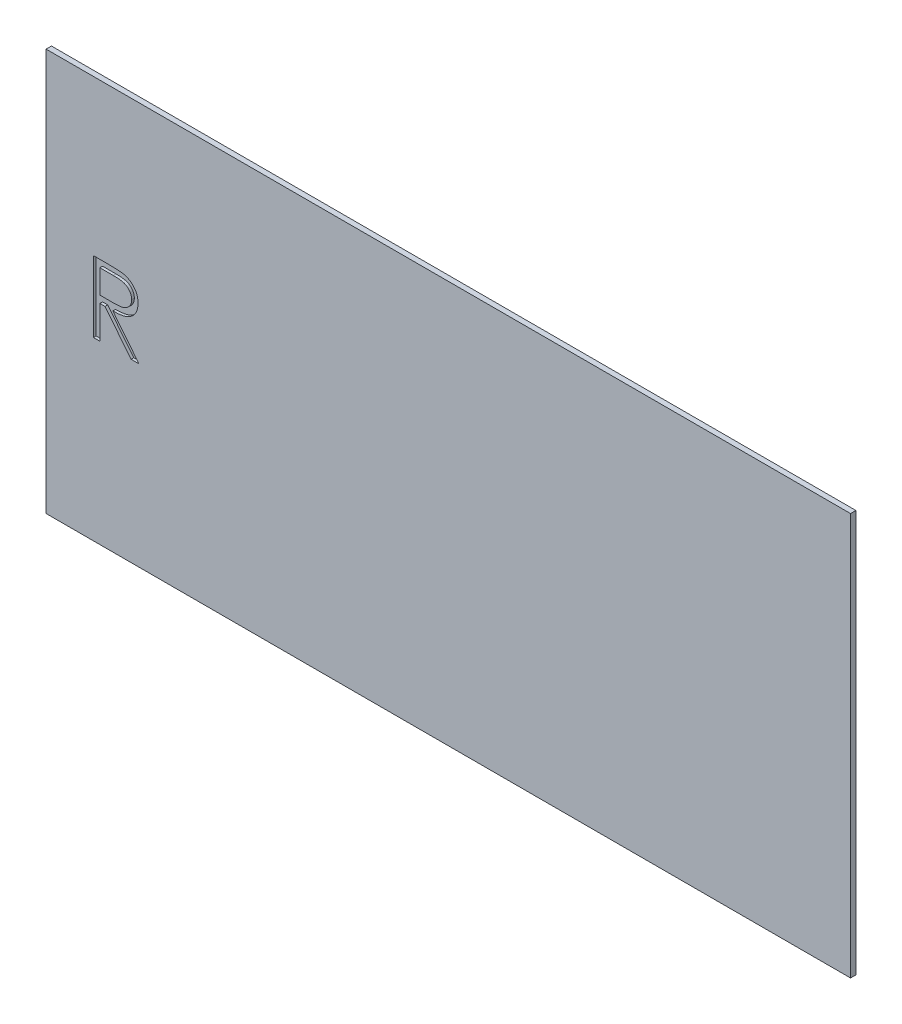
ISO-10303-21;
HEADER;
FILE_DESCRIPTION(('STEP AP214'),'2;1');
FILE_NAME('part.step','',(''),(''),'','','');
FILE_SCHEMA(('AUTOMOTIVE_DESIGN { 1 0 10303 214 1 1 1 1 }'));
ENDSEC;
DATA;
#1=APPLICATION_CONTEXT('core data for automotive mechanical design processes');
#2=APPLICATION_PROTOCOL_DEFINITION('international standard','automotive_design',2000,#1);
#3=PRODUCT_CONTEXT('',#1,'mechanical');
#4=PRODUCT('Part','Part','',(#3));
#5=PRODUCT_RELATED_PRODUCT_CATEGORY('part','',(#4));
#6=PRODUCT_DEFINITION_FORMATION('','',#4);
#7=PRODUCT_DEFINITION_CONTEXT('part definition',#1,'design');
#8=PRODUCT_DEFINITION('design','',#6,#7);
#9=PRODUCT_DEFINITION_SHAPE('','',#8);
#10=(LENGTH_UNIT() NAMED_UNIT(*) SI_UNIT(.MILLI.,.METRE.));
#11=(NAMED_UNIT(*) PLANE_ANGLE_UNIT() SI_UNIT($,.RADIAN.));
#12=(NAMED_UNIT(*) SI_UNIT($,.STERADIAN.) SOLID_ANGLE_UNIT());
#13=UNCERTAINTY_MEASURE_WITH_UNIT(LENGTH_MEASURE(1.E-05),#10,'distance_accuracy_value','');
#14=(GEOMETRIC_REPRESENTATION_CONTEXT(3) GLOBAL_UNCERTAINTY_ASSIGNED_CONTEXT((#13)) GLOBAL_UNIT_ASSIGNED_CONTEXT((#10,
#11,#12)) REPRESENTATION_CONTEXT('',''));
#15=CARTESIAN_POINT('',(0.,0.,0.));
#16=DIRECTION('',(0.,0.,1.));
#17=DIRECTION('',(1.,0.,0.));
#18=AXIS2_PLACEMENT_3D('',#15,#16,#17);
#19=CARTESIAN_POINT('',(0.,0.,10.));
#20=DIRECTION('',(0.,0.,-1.));
#21=DIRECTION('',(-1.,0.,0.));
#22=AXIS2_PLACEMENT_3D('',#19,#20,#21);
#23=PLANE('',#22);
#24=DIRECTION('',(0.,-1.,0.));
#25=VECTOR('',#24,1.);
#26=CARTESIAN_POINT('',(0.,0.,10.));
#27=LINE('',#26,#25);
#28=CARTESIAN_POINT('',(0.,750.,10.));
#29=VERTEX_POINT('',#28);
#30=CARTESIAN_POINT('',(0.,0.,10.));
#31=VERTEX_POINT('',#30);
#32=EDGE_CURVE('E364',#29,#31,#27,.T.);
#33=ORIENTED_EDGE('',*,*,#32,.T.);
#34=DIRECTION('',(1.,0.,0.));
#35=VECTOR('',#34,1.);
#36=CARTESIAN_POINT('',(0.,0.,10.));
#37=LINE('',#36,#35);
#38=CARTESIAN_POINT('',(1500.,0.,10.));
#39=VERTEX_POINT('',#38);
#40=EDGE_CURVE('E367',#31,#39,#37,.T.);
#41=ORIENTED_EDGE('',*,*,#40,.T.);
#42=DIRECTION('',(0.,1.,0.));
#43=VECTOR('',#42,1.);
#44=CARTESIAN_POINT('',(1500.,0.,10.));
#45=LINE('',#44,#43);
#46=CARTESIAN_POINT('',(1500.,750.,10.));
#47=VERTEX_POINT('',#46);
#48=EDGE_CURVE('E370',#39,#47,#45,.T.);
#49=ORIENTED_EDGE('',*,*,#48,.T.);
#50=DIRECTION('',(-1.,0.,0.));
#51=VECTOR('',#50,1.);
#52=CARTESIAN_POINT('',(0.,750.,10.));
#53=LINE('',#52,#51);
#54=EDGE_CURVE('E372',#47,#29,#53,.T.);
#55=ORIENTED_EDGE('',*,*,#54,.T.);
#56=EDGE_LOOP('',(#33,#41,#49,#55));
#57=FACE_BOUND('',#56,.T.);
#58=DIRECTION('',(0.,1.,0.));
#59=VECTOR('',#58,1.);
#60=CARTESIAN_POINT('',(88.344425578022,328.355810368318,10.));
#61=LINE('',#60,#59);
#62=CARTESIAN_POINT('',(88.344425578022,328.355810368318,10.));
#63=VERTEX_POINT('',#62);
#64=CARTESIAN_POINT('',(88.344425578022,460.647477034985,10.));
#65=VERTEX_POINT('',#64);
#66=EDGE_CURVE('E49',#63,#65,#61,.T.);
#67=ORIENTED_EDGE('',*,*,#66,.T.);
#68=DIRECTION('',(1.,0.,0.));
#69=VECTOR('',#68,1.);
#70=CARTESIAN_POINT('',(88.344425578022,460.647477034985,10.));
#71=LINE('',#70,#69);
#72=CARTESIAN_POINT('',(114.81865935206,460.647477034985,10.));
#73=VERTEX_POINT('',#72);
#74=EDGE_CURVE('E296',#65,#73,#71,.T.);
#75=ORIENTED_EDGE('',*,*,#74,.T.);
#76=CARTESIAN_POINT('',(114.81865935206,460.647477034985,10.));
#77=CARTESIAN_POINT('',(116.585362721473,460.64159625508,10.));
#78=CARTESIAN_POINT('',(119.977628894077,460.63030450623,10.));
#79=CARTESIAN_POINT('',(124.837392386837,460.567342634404,10.));
#80=CARTESIAN_POINT('',(129.25317849369,460.386883356146,10.));
#81=CARTESIAN_POINT('',(133.222678372641,460.231588683053,10.));
#82=CARTESIAN_POINT('',(136.745819200614,459.948411138993,10.));
#83=CARTESIAN_POINT('',(139.833404297338,459.677755727025,10.));
#84=CARTESIAN_POINT('',(142.471213101699,459.32345366782,10.));
#85=CARTESIAN_POINT('',(144.068005695576,458.994409406917,10.));
#86=CARTESIAN_POINT('',(144.790990081227,458.845427088403,10.));
#87=B_SPLINE_CURVE_WITH_KNOTS('',3,(#76,#77,#78,#79,#80,#81,#82,#83,#84,#85,#86),.UNSPECIFIED.,
.F.,.F.,(4,1,1,1,1,1,1,1,4),(0.,0.1762577548178,0.338434413880475,0.484822050787837,
0.617157578266332,0.734698360612477,0.83738518383236,0.926372420929584,1.),.UNSPECIFIED.);
#88=CARTESIAN_POINT('',(144.790990081227,458.845427088403,10.));
#89=VERTEX_POINT('',#88);
#90=EDGE_CURVE('E299',#73,#89,#87,.T.);
#91=ORIENTED_EDGE('',*,*,#90,.T.);
#92=CARTESIAN_POINT('',(144.790990081227,458.845427088403,10.));
#93=CARTESIAN_POINT('',(145.758859505447,458.606290421312,10.));
#94=CARTESIAN_POINT('',(147.673951071789,458.133118521374,10.));
#95=CARTESIAN_POINT('',(150.431289877464,457.13300860929,10.));
#96=CARTESIAN_POINT('',(153.058765812545,455.975659702344,10.));
#97=CARTESIAN_POINT('',(155.545464529466,454.616316702226,10.));
#98=CARTESIAN_POINT('',(157.878930446485,453.044889018175,10.));
#99=CARTESIAN_POINT('',(160.083223741403,451.288504628514,10.));
#100=CARTESIAN_POINT('',(162.168346910824,449.356773934213,10.));
#101=CARTESIAN_POINT('',(164.049974003951,447.200992722654,10.));
#102=CARTESIAN_POINT('',(165.824158398358,444.93931512463,10.));
#103=CARTESIAN_POINT('',(167.320514221445,442.493667172598,10.));
#104=CARTESIAN_POINT('',(168.610413901432,439.936222531065,10.));
#105=CARTESIAN_POINT('',(169.637394752331,437.240971919474,10.));
#106=CARTESIAN_POINT('',(170.464330059203,434.434053756809,10.));
#107=CARTESIAN_POINT('',(171.047405178284,431.490042690037,10.));
#108=CARTESIAN_POINT('',(171.397078044091,428.422351072282,10.));
#109=CARTESIAN_POINT('',(171.4326779415,426.329953924504,10.));
#110=CARTESIAN_POINT('',(171.450728996825,425.268996466074,10.));
#111=B_SPLINE_CURVE_WITH_KNOTS('',3,(#92,#93,#94,#95,#96,#97,#98,#99,#100,#101,#102,#103,#104,
#105,#106,#107,#108,#109,#110),.UNSPECIFIED.,.F.,.F.,(4,1,1,1,1,1,1,1,1,1,1,1,1,1,1,1,4),(0.,
0.0642168426314305,0.127063765693129,0.188744538347829,0.249132102835041,0.309452532710628,
0.369826676247681,0.430650141838468,0.492351931879469,0.554072106262516,0.615689783744975,
0.676797702506537,0.738439048246941,0.801316910064892,0.865184511711542,0.931641324419075,1.),.UNSPECIFIED.);
#112=CARTESIAN_POINT('',(171.450728996825,425.268996466074,10.));
#113=VERTEX_POINT('',#112);
#114=EDGE_CURVE('E304',#89,#113,#111,.T.);
#115=ORIENTED_EDGE('',*,*,#114,.T.);
#116=CARTESIAN_POINT('',(171.450728996825,425.268996466074,10.));
#117=CARTESIAN_POINT('',(171.395204365939,423.506300547744,10.));
#118=CARTESIAN_POINT('',(171.286861429842,420.066824261499,10.));
#119=CARTESIAN_POINT('',(170.276716141937,415.075237374917,9.99999999999999));
#120=CARTESIAN_POINT('',(168.622067925999,410.418974589401,10.));
#121=CARTESIAN_POINT('',(166.341991228325,406.103898692,10.));
#122=CARTESIAN_POINT('',(163.438397949869,402.214121322734,10.));
#123=CARTESIAN_POINT('',(159.948740667093,398.797577327617,10.));
#124=CARTESIAN_POINT('',(155.871072613763,395.938568726714,10.));
#125=CARTESIAN_POINT('',(152.075083588681,393.955977596627,10.));
#126=CARTESIAN_POINT('',(148.721898064434,392.686245633727,10.));
#127=CARTESIAN_POINT('',(145.961412729886,391.792847545901,10.));
#128=CARTESIAN_POINT('',(142.950190663824,391.102588739297,10.));
#129=CARTESIAN_POINT('',(139.717083076042,390.484214711063,10.));
#130=CARTESIAN_POINT('',(136.248635383335,390.017350071104,10.));
#131=CARTESIAN_POINT('',(132.553160680231,389.675410339673,10.));
#132=CARTESIAN_POINT('',(128.628023401355,389.461700760899,10.));
#133=CARTESIAN_POINT('',(125.931576434734,389.42987498087,10.));
#134=CARTESIAN_POINT('',(124.544428916697,389.41350267601,10.));
#135=B_SPLINE_CURVE_WITH_KNOTS('',3,(#116,#117,#118,#119,#120,#121,#122,#123,#124,#125,#126,
#127,#128,#129,#130,#131,#132,#133,#134),.UNSPECIFIED.,.F.,.F.,(4,1,1,1,1,1,1,1,1,1,1,1,1,1,1,1,
4),(0.,0.0787802355821389,0.153720644208585,0.226713530308781,0.299191166065937,
0.371189996837668,0.44300641435341,0.516689173294881,0.593217216623412,0.633872917807846,
0.676989142289979,0.722899506325827,0.771958610506145,0.824211323334836,0.879378650627203,
0.937948119330418,1.),.UNSPECIFIED.);
#136=CARTESIAN_POINT('',(124.544428916697,389.41350267601,10.));
#137=VERTEX_POINT('',#136);
#138=EDGE_CURVE('E312',#113,#137,#135,.T.);
#139=ORIENTED_EDGE('',*,*,#138,.T.);
#140=DIRECTION('',(0.622788232243938,-0.782390450976027,0.));
#141=VECTOR('',#140,1.);
#142=CARTESIAN_POINT('',(124.544428916697,389.41350267601,10.));
#143=LINE('',#142,#141);
#144=CARTESIAN_POINT('',(173.146776005372,328.355810368318,10.));
#145=VERTEX_POINT('',#144);
#146=EDGE_CURVE('E320',#137,#145,#143,.T.);
#147=ORIENTED_EDGE('',*,*,#146,.T.);
#148=DIRECTION('',(-1.,0.,0.));
#149=VECTOR('',#148,1.);
#150=CARTESIAN_POINT('',(173.146776005372,328.355810368318,10.));
#151=LINE('',#150,#149);
#152=CARTESIAN_POINT('',(158.465369087637,328.355810368318,10.));
#153=VERTEX_POINT('',#152);
#154=EDGE_CURVE('E326',#145,#153,#151,.T.);
#155=ORIENTED_EDGE('',*,*,#154,.T.);
#156=DIRECTION('',(-0.622788232243938,0.782390450976027,0.));
#157=VECTOR('',#156,1.);
#158=CARTESIAN_POINT('',(158.465369087637,328.355810368318,10.));
#159=LINE('',#158,#157);
#160=CARTESIAN_POINT('',(109.863021998962,389.41350267601,10.));
#161=VERTEX_POINT('',#160);
#162=EDGE_CURVE('E329',#153,#161,#159,.T.);
#163=ORIENTED_EDGE('',*,*,#162,.T.);
#164=DIRECTION('',(-1.,0.,0.));
#165=VECTOR('',#164,1.);
#166=CARTESIAN_POINT('',(109.863021998962,389.41350267601,10.));
#167=LINE('',#166,#165);
#168=CARTESIAN_POINT('',(100.216754637851,389.41350267601,10.));
#169=VERTEX_POINT('',#168);
#170=EDGE_CURVE('E332',#161,#169,#167,.T.);
#171=ORIENTED_EDGE('',*,*,#170,.T.);
#172=DIRECTION('',(0.,-1.,0.));
#173=VECTOR('',#172,1.);
#174=CARTESIAN_POINT('',(100.216754637851,389.41350267601,10.));
#175=LINE('',#174,#173);
#176=CARTESIAN_POINT('',(100.216754637851,328.355810368318,10.));
#177=VERTEX_POINT('',#176);
#178=EDGE_CURVE('E335',#169,#177,#175,.T.);
#179=ORIENTED_EDGE('',*,*,#178,.T.);
#180=DIRECTION('',(-1.,0.,0.));
#181=VECTOR('',#180,1.);
#182=CARTESIAN_POINT('',(100.216754637851,328.355810368318,10.));
#183=LINE('',#182,#181);
#184=EDGE_CURVE('E338',#177,#63,#183,.T.);
#185=ORIENTED_EDGE('',*,*,#184,.T.);
#186=EDGE_LOOP('',(#67,#75,#91,#115,#139,#147,#155,#163,#171,#179,#185));
#187=FACE_BOUND('',#186,.T.);
#188=ADVANCED_FACE('F34',(#57,#187),#23,.F.);
#189=CARTESIAN_POINT('',(0.,0.,10.));
#190=DIRECTION('',(1.,0.,0.));
#191=DIRECTION('',(0.,0.,-1.));
#192=AXIS2_PLACEMENT_3D('',#189,#190,#191);
#193=PLANE('',#192);
#194=DIRECTION('',(0.,-1.,0.));
#195=VECTOR('',#194,1.);
#196=CARTESIAN_POINT('',(0.,0.,0.));
#197=LINE('',#196,#195);
#198=CARTESIAN_POINT('',(0.,750.,0.));
#199=VERTEX_POINT('',#198);
#200=CARTESIAN_POINT('',(0.,0.,0.));
#201=VERTEX_POINT('',#200);
#202=EDGE_CURVE('E363',#199,#201,#197,.T.);
#203=ORIENTED_EDGE('',*,*,#202,.T.);
#204=DIRECTION('',(0.,0.,-1.));
#205=VECTOR('',#204,1.);
#206=CARTESIAN_POINT('',(0.,0.,10.));
#207=LINE('',#206,#205);
#208=EDGE_CURVE('E11',#31,#201,#207,.T.);
#209=ORIENTED_EDGE('',*,*,#208,.F.);
#210=ORIENTED_EDGE('',*,*,#32,.F.);
#211=DIRECTION('',(0.,0.,-1.));
#212=VECTOR('',#211,1.);
#213=CARTESIAN_POINT('',(0.,750.,10.));
#214=LINE('',#213,#212);
#215=EDGE_CURVE('E374',#29,#199,#214,.T.);
#216=ORIENTED_EDGE('',*,*,#215,.T.);
#217=EDGE_LOOP('',(#203,#209,#210,#216));
#218=FACE_BOUND('',#217,.T.);
#219=ADVANCED_FACE('F36',(#218),#193,.F.);
#220=CARTESIAN_POINT('',(0.,0.,10.));
#221=DIRECTION('',(0.,1.,0.));
#222=DIRECTION('',(0.,0.,1.));
#223=AXIS2_PLACEMENT_3D('',#220,#221,#222);
#224=PLANE('',#223);
#225=DIRECTION('',(1.,0.,0.));
#226=VECTOR('',#225,1.);
#227=CARTESIAN_POINT('',(0.,0.,0.));
#228=LINE('',#227,#226);
#229=CARTESIAN_POINT('',(1500.,0.,0.));
#230=VERTEX_POINT('',#229);
#231=EDGE_CURVE('E377',#201,#230,#228,.T.);
#232=ORIENTED_EDGE('',*,*,#231,.T.);
#233=DIRECTION('',(0.,0.,-1.));
#234=VECTOR('',#233,1.);
#235=CARTESIAN_POINT('',(1500.,0.,10.));
#236=LINE('',#235,#234);
#237=EDGE_CURVE('E42',#39,#230,#236,.T.);
#238=ORIENTED_EDGE('',*,*,#237,.F.);
#239=ORIENTED_EDGE('',*,*,#40,.F.);
#240=ORIENTED_EDGE('',*,*,#208,.T.);
#241=EDGE_LOOP('',(#232,#238,#239,#240));
#242=FACE_BOUND('',#241,.T.);
#243=ADVANCED_FACE('F407',(#242),#224,.F.);
#244=CARTESIAN_POINT('',(1500.,0.,10.));
#245=DIRECTION('',(-1.,0.,0.));
#246=DIRECTION('',(0.,0.,1.));
#247=AXIS2_PLACEMENT_3D('',#244,#245,#246);
#248=PLANE('',#247);
#249=DIRECTION('',(0.,1.,0.));
#250=VECTOR('',#249,1.);
#251=CARTESIAN_POINT('',(1500.,0.,0.));
#252=LINE('',#251,#250);
#253=CARTESIAN_POINT('',(1500.,750.,0.));
#254=VERTEX_POINT('',#253);
#255=EDGE_CURVE('E379',#230,#254,#252,.T.);
#256=ORIENTED_EDGE('',*,*,#255,.T.);
#257=DIRECTION('',(0.,0.,-1.));
#258=VECTOR('',#257,1.);
#259=CARTESIAN_POINT('',(1500.,750.,10.));
#260=LINE('',#259,#258);
#261=EDGE_CURVE('E384',#47,#254,#260,.T.);
#262=ORIENTED_EDGE('',*,*,#261,.F.);
#263=ORIENTED_EDGE('',*,*,#48,.F.);
#264=ORIENTED_EDGE('',*,*,#237,.T.);
#265=EDGE_LOOP('',(#256,#262,#263,#264));
#266=FACE_BOUND('',#265,.T.);
#267=ADVANCED_FACE('F391',(#266),#248,.F.);
#268=CARTESIAN_POINT('',(0.,750.,10.));
#269=DIRECTION('',(0.,-1.,0.));
#270=DIRECTION('',(0.,0.,-1.));
#271=AXIS2_PLACEMENT_3D('',#268,#269,#270);
#272=PLANE('',#271);
#273=DIRECTION('',(-1.,0.,0.));
#274=VECTOR('',#273,1.);
#275=CARTESIAN_POINT('',(0.,750.,0.));
#276=LINE('',#275,#274);
#277=EDGE_CURVE('E368',#254,#199,#276,.T.);
#278=ORIENTED_EDGE('',*,*,#277,.T.);
#279=ORIENTED_EDGE('',*,*,#215,.F.);
#280=ORIENTED_EDGE('',*,*,#54,.F.);
#281=ORIENTED_EDGE('',*,*,#261,.T.);
#282=EDGE_LOOP('',(#278,#279,#280,#281));
#283=FACE_BOUND('',#282,.T.);
#284=ADVANCED_FACE('F400',(#283),#272,.F.);
#285=CARTESIAN_POINT('',(0.,0.,0.));
#286=DIRECTION('',(0.,0.,-1.));
#287=DIRECTION('',(-1.,0.,0.));
#288=AXIS2_PLACEMENT_3D('',#285,#286,#287);
#289=PLANE('',#288);
#290=ORIENTED_EDGE('',*,*,#202,.F.);
#291=ORIENTED_EDGE('',*,*,#277,.F.);
#292=ORIENTED_EDGE('',*,*,#255,.F.);
#293=ORIENTED_EDGE('',*,*,#231,.F.);
#294=EDGE_LOOP('',(#290,#291,#292,#293));
#295=FACE_BOUND('',#294,.T.);
#296=ADVANCED_FACE('F397',(#295),#289,.T.);
#297=CARTESIAN_POINT('',(88.344425578022,328.355810368318,5.));
#298=DIRECTION('',(1.,0.,0.));
#299=DIRECTION('',(0.,0.,-1.));
#300=AXIS2_PLACEMENT_3D('',#297,#298,#299);
#301=PLANE('',#300);
#302=ORIENTED_EDGE('',*,*,#66,.F.);
#303=DIRECTION('',(0.,0.,1.));
#304=VECTOR('',#303,1.);
#305=CARTESIAN_POINT('',(88.344425578022,328.355810368318,5.));
#306=LINE('',#305,#304);
#307=CARTESIAN_POINT('',(88.344425578022,328.355810368318,5.));
#308=VERTEX_POINT('',#307);
#309=EDGE_CURVE('E294',#308,#63,#306,.T.);
#310=ORIENTED_EDGE('',*,*,#309,.F.);
#311=DIRECTION('',(0.,1.,0.));
#312=VECTOR('',#311,1.);
#313=CARTESIAN_POINT('',(88.344425578022,328.355810368318,5.));
#314=LINE('',#313,#312);
#315=CARTESIAN_POINT('',(88.344425578022,460.647477034985,5.));
#316=VERTEX_POINT('',#315);
#317=EDGE_CURVE('E341',#308,#316,#314,.T.);
#318=ORIENTED_EDGE('',*,*,#317,.T.);
#319=DIRECTION('',(0.,0.,1.));
#320=VECTOR('',#319,1.);
#321=CARTESIAN_POINT('',(88.344425578022,460.647477034985,5.));
#322=LINE('',#321,#320);
#323=EDGE_CURVE('E361',#316,#65,#322,.T.);
#324=ORIENTED_EDGE('',*,*,#323,.T.);
#325=EDGE_LOOP('',(#302,#310,#318,#324));
#326=FACE_BOUND('',#325,.T.);
#327=ADVANCED_FACE('F466',(#326),#301,.T.);
#328=CARTESIAN_POINT('',(88.344425578022,460.647477034985,5.));
#329=DIRECTION('',(0.,-1.,0.));
#330=DIRECTION('',(0.,0.,-1.));
#331=AXIS2_PLACEMENT_3D('',#328,#329,#330);
#332=PLANE('',#331);
#333=ORIENTED_EDGE('',*,*,#74,.F.);
#334=ORIENTED_EDGE('',*,*,#323,.F.);
#335=DIRECTION('',(1.,0.,0.));
#336=VECTOR('',#335,1.);
#337=CARTESIAN_POINT('',(88.344425578022,460.647477034985,5.));
#338=LINE('',#337,#336);
#339=CARTESIAN_POINT('',(114.81865935206,460.647477034985,5.));
#340=VERTEX_POINT('',#339);
#341=EDGE_CURVE('E452',#316,#340,#338,.T.);
#342=ORIENTED_EDGE('',*,*,#341,.T.);
#343=DIRECTION('',(0.,0.,1.));
#344=VECTOR('',#343,1.);
#345=CARTESIAN_POINT('',(114.81865935206,460.647477034985,5.));
#346=LINE('',#345,#344);
#347=EDGE_CURVE('E359',#340,#73,#346,.T.);
#348=ORIENTED_EDGE('',*,*,#347,.T.);
#349=EDGE_LOOP('',(#333,#334,#342,#348));
#350=FACE_BOUND('',#349,.T.);
#351=ADVANCED_FACE('F463',(#350),#332,.T.);
#352=CARTESIAN_POINT('',(114.81865935206,460.647477034985,5.));
#353=CARTESIAN_POINT('',(116.585362721473,460.64159625508,5.));
#354=CARTESIAN_POINT('',(119.977628894077,460.63030450623,5.));
#355=CARTESIAN_POINT('',(124.837392386837,460.567342634404,5.));
#356=CARTESIAN_POINT('',(129.25317849369,460.386883356146,5.));
#357=CARTESIAN_POINT('',(133.222678372641,460.231588683053,5.));
#358=CARTESIAN_POINT('',(136.745819200614,459.948411138993,5.));
#359=CARTESIAN_POINT('',(139.833404297338,459.677755727025,5.));
#360=CARTESIAN_POINT('',(142.471213101699,459.32345366782,5.));
#361=CARTESIAN_POINT('',(144.068005695576,458.994409406917,5.));
#362=CARTESIAN_POINT('',(144.790990081227,458.845427088403,5.));
#363=B_SPLINE_CURVE_WITH_KNOTS('',3,(#352,#353,#354,#355,#356,#357,#358,#359,#360,#361,#362),
.UNSPECIFIED.,.F.,.F.,(4,1,1,1,1,1,1,1,4),(0.,0.1762577548178,0.338434413880475,
0.484822050787837,0.617157578266332,0.734698360612477,0.83738518383236,0.926372420929584,1.),.UNSPECIFIED.);
#364=DIRECTION('',(0.,0.,1.));
#365=VECTOR('',#364,1.);
#366=SURFACE_OF_LINEAR_EXTRUSION('',#363,#365);
#367=ORIENTED_EDGE('',*,*,#90,.F.);
#368=ORIENTED_EDGE('',*,*,#347,.F.);
#369=CARTESIAN_POINT('',(144.790990081227,458.845427088403,5.));
#370=VERTEX_POINT('',#369);
#371=EDGE_CURVE('E453',#340,#370,#363,.T.);
#372=ORIENTED_EDGE('',*,*,#371,.T.);
#373=DIRECTION('',(0.,0.,1.));
#374=VECTOR('',#373,1.);
#375=CARTESIAN_POINT('',(144.790990081227,458.845427088403,5.));
#376=LINE('',#375,#374);
#377=EDGE_CURVE('E357',#370,#89,#376,.T.);
#378=ORIENTED_EDGE('',*,*,#377,.T.);
#379=EDGE_LOOP('',(#367,#368,#372,#378));
#380=FACE_BOUND('',#379,.T.);
#381=ADVANCED_FACE('F460',(#380),#366,.T.);
#382=CARTESIAN_POINT('',(144.790990081227,458.845427088403,5.));
#383=CARTESIAN_POINT('',(145.758859505447,458.606290421312,5.));
#384=CARTESIAN_POINT('',(147.673951071789,458.133118521374,5.));
#385=CARTESIAN_POINT('',(150.431289877464,457.13300860929,5.));
#386=CARTESIAN_POINT('',(153.058765812545,455.975659702344,5.));
#387=CARTESIAN_POINT('',(155.545464529466,454.616316702226,5.));
#388=CARTESIAN_POINT('',(157.878930446485,453.044889018175,5.));
#389=CARTESIAN_POINT('',(160.083223741403,451.288504628514,5.));
#390=CARTESIAN_POINT('',(162.168346910824,449.356773934213,5.));
#391=CARTESIAN_POINT('',(164.049974003951,447.200992722654,5.));
#392=CARTESIAN_POINT('',(165.824158398358,444.93931512463,5.));
#393=CARTESIAN_POINT('',(167.320514221445,442.493667172598,5.));
#394=CARTESIAN_POINT('',(168.610413901432,439.936222531065,5.));
#395=CARTESIAN_POINT('',(169.637394752331,437.240971919474,5.));
#396=CARTESIAN_POINT('',(170.464330059203,434.434053756809,5.));
#397=CARTESIAN_POINT('',(171.047405178284,431.490042690037,5.));
#398=CARTESIAN_POINT('',(171.397078044091,428.422351072282,5.));
#399=CARTESIAN_POINT('',(171.4326779415,426.329953924504,5.));
#400=CARTESIAN_POINT('',(171.450728996825,425.268996466074,5.));
#401=B_SPLINE_CURVE_WITH_KNOTS('',3,(#382,#383,#384,#385,#386,#387,#388,#389,#390,#391,#392,
#393,#394,#395,#396,#397,#398,#399,#400),.UNSPECIFIED.,.F.,.F.,(4,1,1,1,1,1,1,1,1,1,1,1,1,1,1,1,
4),(0.,0.0642168426314305,0.127063765693129,0.188744538347829,0.249132102835041,
0.309452532710628,0.369826676247681,0.430650141838468,0.492351931879469,0.554072106262516,
0.615689783744975,0.676797702506537,0.738439048246941,0.801316910064892,0.865184511711542,
0.931641324419075,1.),.UNSPECIFIED.);
#402=DIRECTION('',(0.,0.,1.));
#403=VECTOR('',#402,1.);
#404=SURFACE_OF_LINEAR_EXTRUSION('',#401,#403);
#405=ORIENTED_EDGE('',*,*,#114,.F.);
#406=ORIENTED_EDGE('',*,*,#377,.F.);
#407=CARTESIAN_POINT('',(171.450728996825,425.268996466074,5.));
#408=VERTEX_POINT('',#407);
#409=EDGE_CURVE('E275',#370,#408,#401,.T.);
#410=ORIENTED_EDGE('',*,*,#409,.T.);
#411=DIRECTION('',(0.,0.,1.));
#412=VECTOR('',#411,1.);
#413=CARTESIAN_POINT('',(171.450728996825,425.268996466074,5.));
#414=LINE('',#413,#412);
#415=EDGE_CURVE('E355',#408,#113,#414,.T.);
#416=ORIENTED_EDGE('',*,*,#415,.T.);
#417=EDGE_LOOP('',(#405,#406,#410,#416));
#418=FACE_BOUND('',#417,.T.);
#419=ADVANCED_FACE('F265',(#418),#404,.T.);
#420=CARTESIAN_POINT('',(171.450728996825,425.268996466074,5.));
#421=CARTESIAN_POINT('',(171.395204365939,423.506300547744,5.));
#422=CARTESIAN_POINT('',(171.286861429842,420.066824261499,5.));
#423=CARTESIAN_POINT('',(170.276716141937,415.075237374917,4.99999999999999));
#424=CARTESIAN_POINT('',(168.622067925999,410.418974589401,5.00000000000001));
#425=CARTESIAN_POINT('',(166.341991228325,406.103898692,5.));
#426=CARTESIAN_POINT('',(163.438397949869,402.214121322734,5.));
#427=CARTESIAN_POINT('',(159.948740667093,398.797577327617,5.));
#428=CARTESIAN_POINT('',(155.871072613763,395.938568726714,5.));
#429=CARTESIAN_POINT('',(152.075083588681,393.955977596627,5.));
#430=CARTESIAN_POINT('',(148.721898064434,392.686245633727,5.));
#431=CARTESIAN_POINT('',(145.961412729886,391.792847545901,5.));
#432=CARTESIAN_POINT('',(142.950190663824,391.102588739297,5.));
#433=CARTESIAN_POINT('',(139.717083076042,390.484214711063,5.));
#434=CARTESIAN_POINT('',(136.248635383335,390.017350071104,5.));
#435=CARTESIAN_POINT('',(132.553160680231,389.675410339673,5.));
#436=CARTESIAN_POINT('',(128.628023401355,389.461700760899,5.));
#437=CARTESIAN_POINT('',(125.931576434734,389.42987498087,5.));
#438=CARTESIAN_POINT('',(124.544428916697,389.41350267601,5.));
#439=B_SPLINE_CURVE_WITH_KNOTS('',3,(#420,#421,#422,#423,#424,#425,#426,#427,#428,#429,#430,
#431,#432,#433,#434,#435,#436,#437,#438),.UNSPECIFIED.,.F.,.F.,(4,1,1,1,1,1,1,1,1,1,1,1,1,1,1,1,
4),(0.,0.0787802355821389,0.153720644208585,0.226713530308781,0.299191166065937,
0.371189996837668,0.44300641435341,0.516689173294881,0.593217216623412,0.633872917807846,
0.676989142289979,0.722899506325827,0.771958610506145,0.824211323334836,0.879378650627203,
0.937948119330418,1.),.UNSPECIFIED.);
#440=DIRECTION('',(0.,0.,1.));
#441=VECTOR('',#440,1.);
#442=SURFACE_OF_LINEAR_EXTRUSION('',#439,#441);
#443=ORIENTED_EDGE('',*,*,#138,.F.);
#444=ORIENTED_EDGE('',*,*,#415,.F.);
#445=CARTESIAN_POINT('',(124.544428916697,389.41350267601,5.));
#446=VERTEX_POINT('',#445);
#447=EDGE_CURVE('E269',#408,#446,#439,.T.);
#448=ORIENTED_EDGE('',*,*,#447,.T.);
#449=DIRECTION('',(0.,0.,1.));
#450=VECTOR('',#449,1.);
#451=CARTESIAN_POINT('',(124.544428916697,389.41350267601,5.));
#452=LINE('',#451,#450);
#453=EDGE_CURVE('E353',#446,#137,#452,.T.);
#454=ORIENTED_EDGE('',*,*,#453,.T.);
#455=EDGE_LOOP('',(#443,#444,#448,#454));
#456=FACE_BOUND('',#455,.T.);
#457=ADVANCED_FACE('F260',(#456),#442,.T.);
#458=CARTESIAN_POINT('',(124.544428916697,389.41350267601,5.));
#459=DIRECTION('',(-0.782390450976027,-0.622788232243938,0.));
#460=DIRECTION('',(0.622788232243938,-0.782390450976027,0.));
#461=AXIS2_PLACEMENT_3D('',#458,#459,#460);
#462=PLANE('',#461);
#463=ORIENTED_EDGE('',*,*,#146,.F.);
#464=ORIENTED_EDGE('',*,*,#453,.F.);
#465=DIRECTION('',(0.622788232243938,-0.782390450976027,0.));
#466=VECTOR('',#465,1.);
#467=CARTESIAN_POINT('',(124.544428916697,389.41350267601,5.));
#468=LINE('',#467,#466);
#469=CARTESIAN_POINT('',(173.146776005372,328.355810368318,5.));
#470=VERTEX_POINT('',#469);
#471=EDGE_CURVE('E274',#446,#470,#468,.T.);
#472=ORIENTED_EDGE('',*,*,#471,.T.);
#473=DIRECTION('',(0.,0.,1.));
#474=VECTOR('',#473,1.);
#475=CARTESIAN_POINT('',(173.146776005372,328.355810368318,5.));
#476=LINE('',#475,#474);
#477=EDGE_CURVE('E351',#470,#145,#476,.T.);
#478=ORIENTED_EDGE('',*,*,#477,.T.);
#479=EDGE_LOOP('',(#463,#464,#472,#478));
#480=FACE_BOUND('',#479,.T.);
#481=ADVANCED_FACE('F256',(#480),#462,.T.);
#482=CARTESIAN_POINT('',(173.146776005372,328.355810368318,5.));
#483=DIRECTION('',(0.,1.,0.));
#484=DIRECTION('',(0.,0.,1.));
#485=AXIS2_PLACEMENT_3D('',#482,#483,#484);
#486=PLANE('',#485);
#487=ORIENTED_EDGE('',*,*,#154,.F.);
#488=ORIENTED_EDGE('',*,*,#477,.F.);
#489=DIRECTION('',(-1.,0.,0.));
#490=VECTOR('',#489,1.);
#491=CARTESIAN_POINT('',(173.146776005372,328.355810368318,5.));
#492=LINE('',#491,#490);
#493=CARTESIAN_POINT('',(158.465369087637,328.355810368318,5.));
#494=VERTEX_POINT('',#493);
#495=EDGE_CURVE('E284',#470,#494,#492,.T.);
#496=ORIENTED_EDGE('',*,*,#495,.T.);
#497=DIRECTION('',(0.,0.,1.));
#498=VECTOR('',#497,1.);
#499=CARTESIAN_POINT('',(158.465369087637,328.355810368318,5.));
#500=LINE('',#499,#498);
#501=EDGE_CURVE('E349',#494,#153,#500,.T.);
#502=ORIENTED_EDGE('',*,*,#501,.T.);
#503=EDGE_LOOP('',(#487,#488,#496,#502));
#504=FACE_BOUND('',#503,.T.);
#505=ADVANCED_FACE('F252',(#504),#486,.T.);
#506=CARTESIAN_POINT('',(158.465369087637,328.355810368318,5.));
#507=DIRECTION('',(0.782390450976027,0.622788232243938,0.));
#508=DIRECTION('',(-0.622788232243938,0.782390450976027,0.));
#509=AXIS2_PLACEMENT_3D('',#506,#507,#508);
#510=PLANE('',#509);
#511=ORIENTED_EDGE('',*,*,#162,.F.);
#512=ORIENTED_EDGE('',*,*,#501,.F.);
#513=DIRECTION('',(-0.622788232243938,0.782390450976027,0.));
#514=VECTOR('',#513,1.);
#515=CARTESIAN_POINT('',(158.465369087637,328.355810368318,5.));
#516=LINE('',#515,#514);
#517=CARTESIAN_POINT('',(109.863021998962,389.41350267601,5.));
#518=VERTEX_POINT('',#517);
#519=EDGE_CURVE('E286',#494,#518,#516,.T.);
#520=ORIENTED_EDGE('',*,*,#519,.T.);
#521=DIRECTION('',(0.,0.,1.));
#522=VECTOR('',#521,1.);
#523=CARTESIAN_POINT('',(109.863021998962,389.41350267601,5.));
#524=LINE('',#523,#522);
#525=EDGE_CURVE('E347',#518,#161,#524,.T.);
#526=ORIENTED_EDGE('',*,*,#525,.T.);
#527=EDGE_LOOP('',(#511,#512,#520,#526));
#528=FACE_BOUND('',#527,.T.);
#529=ADVANCED_FACE('F248',(#528),#510,.T.);
#530=CARTESIAN_POINT('',(109.863021998962,389.41350267601,5.));
#531=DIRECTION('',(0.,1.,0.));
#532=DIRECTION('',(0.,0.,1.));
#533=AXIS2_PLACEMENT_3D('',#530,#531,#532);
#534=PLANE('',#533);
#535=ORIENTED_EDGE('',*,*,#170,.F.);
#536=ORIENTED_EDGE('',*,*,#525,.F.);
#537=DIRECTION('',(-1.,0.,0.));
#538=VECTOR('',#537,1.);
#539=CARTESIAN_POINT('',(109.863021998962,389.41350267601,5.));
#540=LINE('',#539,#538);
#541=CARTESIAN_POINT('',(100.216754637851,389.41350267601,5.));
#542=VERTEX_POINT('',#541);
#543=EDGE_CURVE('E288',#518,#542,#540,.T.);
#544=ORIENTED_EDGE('',*,*,#543,.T.);
#545=DIRECTION('',(0.,0.,1.));
#546=VECTOR('',#545,1.);
#547=CARTESIAN_POINT('',(100.216754637851,389.41350267601,5.));
#548=LINE('',#547,#546);
#549=EDGE_CURVE('E345',#542,#169,#548,.T.);
#550=ORIENTED_EDGE('',*,*,#549,.T.);
#551=EDGE_LOOP('',(#535,#536,#544,#550));
#552=FACE_BOUND('',#551,.T.);
#553=ADVANCED_FACE('F244',(#552),#534,.T.);
#554=CARTESIAN_POINT('',(100.216754637851,389.41350267601,5.));
#555=DIRECTION('',(-1.,0.,0.));
#556=DIRECTION('',(0.,0.,1.));
#557=AXIS2_PLACEMENT_3D('',#554,#555,#556);
#558=PLANE('',#557);
#559=ORIENTED_EDGE('',*,*,#178,.F.);
#560=ORIENTED_EDGE('',*,*,#549,.F.);
#561=DIRECTION('',(0.,-1.,0.));
#562=VECTOR('',#561,1.);
#563=CARTESIAN_POINT('',(100.216754637851,389.41350267601,5.));
#564=LINE('',#563,#562);
#565=CARTESIAN_POINT('',(100.216754637851,328.355810368318,5.));
#566=VERTEX_POINT('',#565);
#567=EDGE_CURVE('E290',#542,#566,#564,.T.);
#568=ORIENTED_EDGE('',*,*,#567,.T.);
#569=DIRECTION('',(0.,0.,1.));
#570=VECTOR('',#569,1.);
#571=CARTESIAN_POINT('',(100.216754637851,328.355810368318,5.));
#572=LINE('',#571,#570);
#573=EDGE_CURVE('E343',#566,#177,#572,.T.);
#574=ORIENTED_EDGE('',*,*,#573,.T.);
#575=EDGE_LOOP('',(#559,#560,#568,#574));
#576=FACE_BOUND('',#575,.T.);
#577=ADVANCED_FACE('F240',(#576),#558,.T.);
#578=CARTESIAN_POINT('',(100.216754637851,328.355810368318,5.));
#579=DIRECTION('',(0.,1.,0.));
#580=DIRECTION('',(0.,0.,1.));
#581=AXIS2_PLACEMENT_3D('',#578,#579,#580);
#582=PLANE('',#581);
#583=ORIENTED_EDGE('',*,*,#184,.F.);
#584=ORIENTED_EDGE('',*,*,#573,.F.);
#585=DIRECTION('',(-1.,0.,0.));
#586=VECTOR('',#585,1.);
#587=CARTESIAN_POINT('',(100.216754637851,328.355810368318,5.));
#588=LINE('',#587,#586);
#589=EDGE_CURVE('E292',#566,#308,#588,.T.);
#590=ORIENTED_EDGE('',*,*,#589,.T.);
#591=ORIENTED_EDGE('',*,*,#309,.T.);
#592=EDGE_LOOP('',(#583,#584,#590,#591));
#593=FACE_BOUND('',#592,.T.);
#594=ADVANCED_FACE('F237',(#593),#582,.T.);
#595=CARTESIAN_POINT('',(129.850150669113,460.36424692873,5.));
#596=DIRECTION('',(0.,0.,1.));
#597=DIRECTION('',(0.,-1.,0.));
#598=AXIS2_PLACEMENT_3D('',#595,#596,#597);
#599=PLANE('',#598);
#600=CARTESIAN_POINT('',(159.578399936996,425.295497200583,5.));
#601=CARTESIAN_POINT('',(159.532962622044,426.359370671913,5.));
#602=CARTESIAN_POINT('',(159.442922443513,428.467579693395,5.));
#603=CARTESIAN_POINT('',(158.707805299795,431.553978683433,5.));
#604=CARTESIAN_POINT('',(157.464664992572,434.466925905638,5.));
#605=CARTESIAN_POINT('',(155.789389928153,437.194571618122,5.));
#606=CARTESIAN_POINT('',(153.748350439987,439.67053246738,5.));
#607=CARTESIAN_POINT('',(151.355087876827,441.788981407352,5.));
#608=CARTESIAN_POINT('',(148.675040322047,443.537101054411,5.));
#609=CARTESIAN_POINT('',(146.170146812913,444.654186270187,5.));
#610=CARTESIAN_POINT('',(143.93123461454,445.339073580375,5.));
#611=CARTESIAN_POINT('',(141.987315916565,445.821037212519,5.));
#612=CARTESIAN_POINT('',(139.790840419434,446.208253746478,5.));
#613=CARTESIAN_POINT('',(137.331143025471,446.518498904559,5.));
#614=CARTESIAN_POINT('',(134.618724242828,446.785158999677,5.));
#615=CARTESIAN_POINT('',(131.639869275976,446.964764919195,5.));
#616=CARTESIAN_POINT('',(128.41434216491,447.071122282726,5.));
#617=CARTESIAN_POINT('',(126.1787289919,447.076379511247,5.));
#618=CARTESIAN_POINT('',(125.021442137851,447.079100966609,5.));
#619=B_SPLINE_CURVE_WITH_KNOTS('',3,(#600,#601,#602,#603,#604,#605,#606,#607,#608,#609,#610,
#611,#612,#613,#614,#615,#616,#617,#618),.UNSPECIFIED.,.F.,.F.,(4,1,1,1,1,1,1,1,1,1,1,1,1,1,1,1,
4),(0.,0.0688142958243085,0.136364824552214,0.204019353511246,0.273063738624611,
0.342913319561489,0.410965444138957,0.479168766513447,0.549308006509782,0.58765157641765,
0.63064666876279,0.678878785696648,0.731934299229582,0.791111422948047,0.855283189513077,
0.925085938677385,1.),.UNSPECIFIED.);
#620=CARTESIAN_POINT('',(159.578399936996,425.295497200583,5.));
#621=VERTEX_POINT('',#620);
#622=CARTESIAN_POINT('',(125.021442137851,447.079100966609,5.));
#623=VERTEX_POINT('',#622);
#624=EDGE_CURVE('E185',#621,#623,#619,.T.);
#625=ORIENTED_EDGE('',*,*,#624,.F.);
#626=CARTESIAN_POINT('',(124.438425978663,402.796373602827,5.));
#627=CARTESIAN_POINT('',(125.569332211721,402.795873288815,5.));
#628=CARTESIAN_POINT('',(127.761350590937,402.794903537764,5.));
#629=CARTESIAN_POINT('',(130.93259595732,402.945858770779,5.));
#630=CARTESIAN_POINT('',(133.885350178996,403.11758538294,5.));
#631=CARTESIAN_POINT('',(136.608319085135,403.380254098167,5.));
#632=CARTESIAN_POINT('',(139.102719104896,403.718772285421,5.));
#633=CARTESIAN_POINT('',(141.367303473689,404.142218415869,5.));
#634=CARTESIAN_POINT('',(143.405768828119,404.635555307582,5.));
#635=CARTESIAN_POINT('',(145.783183822072,405.39912866409,5.));
#636=CARTESIAN_POINT('',(148.437957477528,406.608879949711,5.));
#637=CARTESIAN_POINT('',(151.323104919309,408.36894493013,5.));
#638=CARTESIAN_POINT('',(153.780038518809,410.582718184377,5.));
#639=CARTESIAN_POINT('',(155.855802957121,413.114155361868,5.));
#640=CARTESIAN_POINT('',(157.523790396813,415.89743024353,5.));
#641=CARTESIAN_POINT('',(158.699751974339,418.899179913309,5.));
#642=CARTESIAN_POINT('',(159.445969287164,422.043624242763,5.));
#643=CARTESIAN_POINT('',(159.533982760997,424.204820580942,5.));
#644=CARTESIAN_POINT('',(159.578399936996,425.295497200583,5.));
#645=B_SPLINE_CURVE_WITH_KNOTS('',3,(#626,#627,#628,#629,#630,#631,#632,#633,#634,#635,#636,
#637,#638,#639,#640,#641,#642,#643,#644),.UNSPECIFIED.,.F.,.F.,(4,1,1,1,1,1,1,1,1,1,1,1,1,1,1,1,
4),(0.,0.0716681496796052,0.138913286274205,0.201184570026559,0.259124428290545,
0.312255041426235,0.36068150962311,0.405086143328644,0.445101658590711,0.51877778048826,
0.589461579033198,0.658462241985716,0.727283218368366,0.796322486904719,0.86317489320788,
0.930949380987855,1.),.UNSPECIFIED.);
#646=CARTESIAN_POINT('',(124.438425978663,402.796373602827,5.));
#647=VERTEX_POINT('',#646);
#648=EDGE_CURVE('E207',#647,#621,#645,.T.);
#649=ORIENTED_EDGE('',*,*,#648,.F.);
#650=DIRECTION('',(0.999970673881285,-0.00765841872775686,0.));
#651=VECTOR('',#650,1.);
#652=CARTESIAN_POINT('',(100.216754637851,402.981878744386,5.));
#653=LINE('',#652,#651);
#654=CARTESIAN_POINT('',(100.216754637851,402.981878744386,4.99999999999787));
#655=VERTEX_POINT('',#654);
#656=EDGE_CURVE('E196',#655,#647,#653,.T.);
#657=ORIENTED_EDGE('',*,*,#656,.F.);
#658=DIRECTION('',(0.,-1.,0.));
#659=VECTOR('',#658,1.);
#660=CARTESIAN_POINT('',(100.216754637851,447.079100966609,5.));
#661=LINE('',#660,#659);
#662=CARTESIAN_POINT('',(100.216754637851,447.079100966609,5.));
#663=VERTEX_POINT('',#662);
#664=EDGE_CURVE('E177',#663,#655,#661,.T.);
#665=ORIENTED_EDGE('',*,*,#664,.F.);
#666=DIRECTION('',(-1.,0.,0.));
#667=VECTOR('',#666,1.);
#668=CARTESIAN_POINT('',(125.021442137851,447.079100966609,5.));
#669=LINE('',#668,#667);
#670=EDGE_CURVE('E192',#623,#663,#669,.T.);
#671=ORIENTED_EDGE('',*,*,#670,.F.);
#672=EDGE_LOOP('',(#625,#649,#657,#665,#671));
#673=FACE_BOUND('',#672,.T.);
#674=ORIENTED_EDGE('',*,*,#317,.F.);
#675=ORIENTED_EDGE('',*,*,#589,.F.);
#676=ORIENTED_EDGE('',*,*,#567,.F.);
#677=ORIENTED_EDGE('',*,*,#543,.F.);
#678=ORIENTED_EDGE('',*,*,#519,.F.);
#679=ORIENTED_EDGE('',*,*,#495,.F.);
#680=ORIENTED_EDGE('',*,*,#471,.F.);
#681=ORIENTED_EDGE('',*,*,#447,.F.);
#682=ORIENTED_EDGE('',*,*,#409,.F.);
#683=ORIENTED_EDGE('',*,*,#371,.F.);
#684=ORIENTED_EDGE('',*,*,#341,.F.);
#685=EDGE_LOOP('',(#674,#675,#676,#677,#678,#679,#680,#681,#682,#683,#684));
#686=FACE_BOUND('',#685,.T.);
#687=ADVANCED_FACE('F190',(#673,#686),#599,.T.);
#688=CARTESIAN_POINT('',(125.021442137851,447.079100966609,5.));
#689=DIRECTION('',(0.,1.,0.));
#690=DIRECTION('',(0.,0.,1.));
#691=AXIS2_PLACEMENT_3D('',#688,#689,#690);
#692=PLANE('',#691);
#693=DIRECTION('',(-1.,0.,0.));
#694=VECTOR('',#693,1.);
#695=CARTESIAN_POINT('',(125.021442137851,447.079100966609,10.));
#696=LINE('',#695,#694);
#697=CARTESIAN_POINT('',(125.021442137851,447.079100966609,10.));
#698=VERTEX_POINT('',#697);
#699=CARTESIAN_POINT('',(100.216754637851,447.079100966609,9.9999999999995));
#700=VERTEX_POINT('',#699);
#701=EDGE_CURVE('E427',#698,#700,#696,.T.);
#702=ORIENTED_EDGE('',*,*,#701,.F.);
#703=DIRECTION('',(0.,0.,1.));
#704=VECTOR('',#703,1.);
#705=CARTESIAN_POINT('',(125.021442137851,447.079100966609,5.));
#706=LINE('',#705,#704);
#707=EDGE_CURVE('E199',#623,#698,#706,.T.);
#708=ORIENTED_EDGE('',*,*,#707,.F.);
#709=ORIENTED_EDGE('',*,*,#670,.T.);
#710=DIRECTION('',(0.,0.,1.));
#711=VECTOR('',#710,1.);
#712=CARTESIAN_POINT('',(100.216754637851,447.079100966609,5.));
#713=LINE('',#712,#711);
#714=EDGE_CURVE('E174',#663,#700,#713,.T.);
#715=ORIENTED_EDGE('',*,*,#714,.T.);
#716=EDGE_LOOP('',(#702,#708,#709,#715));
#717=FACE_BOUND('',#716,.T.);
#718=ADVANCED_FACE('F198',(#717),#692,.T.);
#719=DIRECTION('',(0.,0.,1.));
#720=VECTOR('',#719,1.);
#721=SURFACE_OF_LINEAR_EXTRUSION('',#619,#720);
#722=CARTESIAN_POINT('',(159.578399936996,425.295497200583,10.));
#723=CARTESIAN_POINT('',(159.532962622044,426.359370671913,10.));
#724=CARTESIAN_POINT('',(159.442922443513,428.467579693395,10.));
#725=CARTESIAN_POINT('',(158.707805299795,431.553978683433,10.));
#726=CARTESIAN_POINT('',(157.464664992572,434.466925905638,10.));
#727=CARTESIAN_POINT('',(155.789389928153,437.194571618122,10.));
#728=CARTESIAN_POINT('',(153.748350439987,439.67053246738,10.));
#729=CARTESIAN_POINT('',(151.355087876827,441.788981407352,10.));
#730=CARTESIAN_POINT('',(148.675040322047,443.537101054411,10.));
#731=CARTESIAN_POINT('',(146.170146812913,444.654186270187,10.));
#732=CARTESIAN_POINT('',(143.93123461454,445.339073580375,10.));
#733=CARTESIAN_POINT('',(141.987315916565,445.821037212519,10.));
#734=CARTESIAN_POINT('',(139.790840419434,446.208253746478,10.));
#735=CARTESIAN_POINT('',(137.331143025471,446.518498904559,10.));
#736=CARTESIAN_POINT('',(134.618724242828,446.785158999677,10.));
#737=CARTESIAN_POINT('',(131.639869275976,446.964764919195,10.));
#738=CARTESIAN_POINT('',(128.41434216491,447.071122282726,10.));
#739=CARTESIAN_POINT('',(126.1787289919,447.076379511247,10.));
#740=CARTESIAN_POINT('',(125.021442137851,447.079100966609,10.));
#741=B_SPLINE_CURVE_WITH_KNOTS('',3,(#722,#723,#724,#725,#726,#727,#728,#729,#730,#731,#732,
#733,#734,#735,#736,#737,#738,#739,#740),.UNSPECIFIED.,.F.,.F.,(4,1,1,1,1,1,1,1,1,1,1,1,1,1,1,1,
4),(0.,0.0688142958243085,0.136364824552214,0.204019353511246,0.273063738624611,
0.342913319561489,0.410965444138957,0.479168766513447,0.549308006509782,0.58765157641765,
0.63064666876279,0.678878785696648,0.731934299229582,0.791111422948047,0.855283189513077,
0.925085938677385,1.),.UNSPECIFIED.);
#742=CARTESIAN_POINT('',(159.578399936996,425.295497200583,10.));
#743=VERTEX_POINT('',#742);
#744=EDGE_CURVE('E200',#743,#698,#741,.T.);
#745=ORIENTED_EDGE('',*,*,#744,.F.);
#746=DIRECTION('',(0.,0.,1.));
#747=VECTOR('',#746,1.);
#748=CARTESIAN_POINT('',(159.578399936996,425.295497200583,5.));
#749=LINE('',#748,#747);
#750=EDGE_CURVE('E445',#621,#743,#749,.T.);
#751=ORIENTED_EDGE('',*,*,#750,.F.);
#752=ORIENTED_EDGE('',*,*,#624,.T.);
#753=ORIENTED_EDGE('',*,*,#707,.T.);
#754=EDGE_LOOP('',(#745,#751,#752,#753));
#755=FACE_BOUND('',#754,.T.);
#756=ADVANCED_FACE('F226',(#755),#721,.T.);
#757=DIRECTION('',(0.,0.,1.));
#758=VECTOR('',#757,1.);
#759=SURFACE_OF_LINEAR_EXTRUSION('',#645,#758);
#760=CARTESIAN_POINT('',(124.438425978663,402.796373602827,10.));
#761=CARTESIAN_POINT('',(125.569332211721,402.795873288815,10.));
#762=CARTESIAN_POINT('',(127.761350590937,402.794903537764,10.));
#763=CARTESIAN_POINT('',(130.93259595732,402.945858770779,10.));
#764=CARTESIAN_POINT('',(133.885350178996,403.11758538294,10.));
#765=CARTESIAN_POINT('',(136.608319085135,403.380254098167,10.));
#766=CARTESIAN_POINT('',(139.102719104896,403.718772285421,10.));
#767=CARTESIAN_POINT('',(141.367303473689,404.142218415869,10.));
#768=CARTESIAN_POINT('',(143.405768828119,404.635555307582,10.));
#769=CARTESIAN_POINT('',(145.783183822072,405.39912866409,10.));
#770=CARTESIAN_POINT('',(148.437957477528,406.608879949711,10.));
#771=CARTESIAN_POINT('',(151.323104919309,408.36894493013,10.));
#772=CARTESIAN_POINT('',(153.780038518809,410.582718184377,10.));
#773=CARTESIAN_POINT('',(155.855802957121,413.114155361868,10.));
#774=CARTESIAN_POINT('',(157.523790396813,415.89743024353,10.));
#775=CARTESIAN_POINT('',(158.699751974339,418.899179913309,10.));
#776=CARTESIAN_POINT('',(159.445969287164,422.043624242763,10.));
#777=CARTESIAN_POINT('',(159.533982760997,424.204820580942,10.));
#778=CARTESIAN_POINT('',(159.578399936996,425.295497200583,10.));
#779=B_SPLINE_CURVE_WITH_KNOTS('',3,(#760,#761,#762,#763,#764,#765,#766,#767,#768,#769,#770,
#771,#772,#773,#774,#775,#776,#777,#778),.UNSPECIFIED.,.F.,.F.,(4,1,1,1,1,1,1,1,1,1,1,1,1,1,1,1,
4),(0.,0.0716681496796052,0.138913286274205,0.201184570026559,0.259124428290545,
0.312255041426235,0.36068150962311,0.405086143328644,0.445101658590711,0.51877778048826,
0.589461579033198,0.658462241985716,0.727283218368366,0.796322486904719,0.86317489320788,
0.930949380987855,1.),.UNSPECIFIED.);
#780=CARTESIAN_POINT('',(124.438425978663,402.796373602827,10.));
#781=VERTEX_POINT('',#780);
#782=EDGE_CURVE('E203',#781,#743,#779,.T.);
#783=ORIENTED_EDGE('',*,*,#782,.F.);
#784=DIRECTION('',(0.,0.,1.));
#785=VECTOR('',#784,1.);
#786=CARTESIAN_POINT('',(124.438425978663,402.796373602827,5.));
#787=LINE('',#786,#785);
#788=EDGE_CURVE('E447',#647,#781,#787,.T.);
#789=ORIENTED_EDGE('',*,*,#788,.F.);
#790=ORIENTED_EDGE('',*,*,#648,.T.);
#791=ORIENTED_EDGE('',*,*,#750,.T.);
#792=EDGE_LOOP('',(#783,#789,#790,#791));
#793=FACE_BOUND('',#792,.T.);
#794=ADVANCED_FACE('F221',(#793),#759,.T.);
#795=CARTESIAN_POINT('',(100.216754637851,402.981878744386,5.));
#796=DIRECTION('',(-0.00765841872775686,-0.999970673881284,0.));
#797=DIRECTION('',(0.999970673881285,-0.00765841872775686,0.));
#798=AXIS2_PLACEMENT_3D('',#795,#796,#797);
#799=PLANE('',#798);
#800=DIRECTION('',(0.999970673881285,-0.00765841872775686,0.));
#801=VECTOR('',#800,1.);
#802=CARTESIAN_POINT('',(100.216754637851,402.981878744386,10.));
#803=LINE('',#802,#801);
#804=CARTESIAN_POINT('',(100.216754637851,402.981878744386,10.));
#805=VERTEX_POINT('',#804);
#806=EDGE_CURVE('E57',#805,#781,#803,.T.);
#807=ORIENTED_EDGE('',*,*,#806,.F.);
#808=DIRECTION('',(0.,0.,1.));
#809=VECTOR('',#808,1.);
#810=CARTESIAN_POINT('',(100.216754637851,402.981878744386,5.));
#811=LINE('',#810,#809);
#812=EDGE_CURVE('E184',#655,#805,#811,.T.);
#813=ORIENTED_EDGE('',*,*,#812,.F.);
#814=ORIENTED_EDGE('',*,*,#656,.T.);
#815=ORIENTED_EDGE('',*,*,#788,.T.);
#816=EDGE_LOOP('',(#807,#813,#814,#815));
#817=FACE_BOUND('',#816,.T.);
#818=ADVANCED_FACE('F225',(#817),#799,.T.);
#819=CARTESIAN_POINT('',(100.216754637851,447.079100966609,5.));
#820=DIRECTION('',(-1.,0.,0.));
#821=DIRECTION('',(0.,0.,1.));
#822=AXIS2_PLACEMENT_3D('',#819,#820,#821);
#823=PLANE('',#822);
#824=DIRECTION('',(0.,-1.,0.));
#825=VECTOR('',#824,1.);
#826=CARTESIAN_POINT('',(100.216754637851,447.079100966609,10.));
#827=LINE('',#826,#825);
#828=EDGE_CURVE('E179',#700,#805,#827,.T.);
#829=ORIENTED_EDGE('',*,*,#828,.F.);
#830=ORIENTED_EDGE('',*,*,#714,.F.);
#831=ORIENTED_EDGE('',*,*,#664,.T.);
#832=ORIENTED_EDGE('',*,*,#812,.T.);
#833=EDGE_LOOP('',(#829,#830,#831,#832));
#834=FACE_BOUND('',#833,.T.);
#835=ADVANCED_FACE('F176',(#834),#823,.T.);
#836=ORIENTED_EDGE('',*,*,#701,.T.);
#837=ORIENTED_EDGE('',*,*,#828,.T.);
#838=ORIENTED_EDGE('',*,*,#806,.T.);
#839=ORIENTED_EDGE('',*,*,#782,.T.);
#840=ORIENTED_EDGE('',*,*,#744,.T.);
#841=EDGE_LOOP('',(#836,#837,#838,#839,#840));
#842=FACE_BOUND('',#841,.T.);
#843=ADVANCED_FACE('F232',(#842),#23,.F.);
#844=CLOSED_SHELL('',(#188,#219,#243,#267,#284,#296,#327,#351,#381,#419,#457,#481,#505,#529,
#553,#577,#594,#687,#718,#756,#794,#818,#835,#843));
#845=MANIFOLD_SOLID_BREP('B2',#844);
#846=ADVANCED_BREP_SHAPE_REPRESENTATION('',(#18,#845),#14);
#847=SHAPE_DEFINITION_REPRESENTATION(#9,#846);
ENDSEC;
END-ISO-10303-21;
